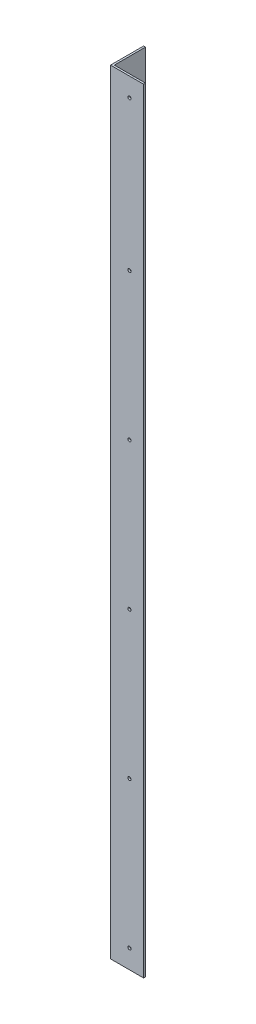
ISO-10303-21;
HEADER;
FILE_DESCRIPTION(('STEP AP214'),'2;1');
FILE_NAME('part.step','',(''),(''),'','','');
FILE_SCHEMA(('AUTOMOTIVE_DESIGN { 1 0 10303 214 1 1 1 1 }'));
ENDSEC;
DATA;
#1=APPLICATION_CONTEXT('core data for automotive mechanical design processes');
#2=APPLICATION_PROTOCOL_DEFINITION('international standard','automotive_design',2000,#1);
#3=PRODUCT_CONTEXT('',#1,'mechanical');
#4=PRODUCT('Part','Part','',(#3));
#5=PRODUCT_RELATED_PRODUCT_CATEGORY('part','',(#4));
#6=PRODUCT_DEFINITION_FORMATION('','',#4);
#7=PRODUCT_DEFINITION_CONTEXT('part definition',#1,'design');
#8=PRODUCT_DEFINITION('design','',#6,#7);
#9=PRODUCT_DEFINITION_SHAPE('','',#8);
#10=(LENGTH_UNIT() NAMED_UNIT(*) SI_UNIT(.MILLI.,.METRE.));
#11=(NAMED_UNIT(*) PLANE_ANGLE_UNIT() SI_UNIT($,.RADIAN.));
#12=(NAMED_UNIT(*) SI_UNIT($,.STERADIAN.) SOLID_ANGLE_UNIT());
#13=UNCERTAINTY_MEASURE_WITH_UNIT(LENGTH_MEASURE(1.E-05),#10,'distance_accuracy_value','');
#14=(GEOMETRIC_REPRESENTATION_CONTEXT(3) GLOBAL_UNCERTAINTY_ASSIGNED_CONTEXT((#13)) GLOBAL_UNIT_ASSIGNED_CONTEXT((#10,
#11,#12)) REPRESENTATION_CONTEXT('',''));
#15=CARTESIAN_POINT('',(0.,0.,0.));
#16=DIRECTION('',(0.,0.,1.));
#17=DIRECTION('',(1.,0.,0.));
#18=AXIS2_PLACEMENT_3D('',#15,#16,#17);
#19=CARTESIAN_POINT('',(0.,819.,-35.));
#20=DIRECTION('',(1.,0.,0.));
#21=DIRECTION('',(0.,0.,-1.));
#22=AXIS2_PLACEMENT_3D('',#19,#20,#21);
#23=PLANE('',#22);
#24=DIRECTION('',(0.,0.,1.));
#25=VECTOR('',#24,1.);
#26=CARTESIAN_POINT('',(0.,0.,-35.));
#27=LINE('',#26,#25);
#28=CARTESIAN_POINT('',(0.,0.,-35.));
#29=VERTEX_POINT('',#28);
#30=CARTESIAN_POINT('',(0.,0.,0.));
#31=VERTEX_POINT('',#30);
#32=EDGE_CURVE('E119',#29,#31,#27,.T.);
#33=ORIENTED_EDGE('',*,*,#32,.T.);
#34=DIRECTION('',(0.,-1.,0.));
#35=VECTOR('',#34,1.);
#36=CARTESIAN_POINT('',(0.,819.,0.));
#37=LINE('',#36,#35);
#38=CARTESIAN_POINT('',(0.,819.,0.));
#39=VERTEX_POINT('',#38);
#40=EDGE_CURVE('E11',#39,#31,#37,.T.);
#41=ORIENTED_EDGE('',*,*,#40,.F.);
#42=DIRECTION('',(0.,0.,1.));
#43=VECTOR('',#42,1.);
#44=CARTESIAN_POINT('',(0.,819.,-35.));
#45=LINE('',#44,#43);
#46=CARTESIAN_POINT('',(0.,819.,-35.));
#47=VERTEX_POINT('',#46);
#48=EDGE_CURVE('E130',#47,#39,#45,.T.);
#49=ORIENTED_EDGE('',*,*,#48,.F.);
#50=DIRECTION('',(0.,-1.,0.));
#51=VECTOR('',#50,1.);
#52=CARTESIAN_POINT('',(0.,819.,-35.));
#53=LINE('',#52,#51);
#54=EDGE_CURVE('E115',#47,#29,#53,.T.);
#55=ORIENTED_EDGE('',*,*,#54,.T.);
#56=EDGE_LOOP('',(#33,#41,#49,#55));
#57=FACE_BOUND('',#56,.T.);
#58=ADVANCED_FACE('F33',(#57),#23,.F.);
#59=CARTESIAN_POINT('',(0.,819.,0.));
#60=DIRECTION('',(0.,0.,-1.));
#61=DIRECTION('',(-1.,0.,0.));
#62=AXIS2_PLACEMENT_3D('',#59,#60,#61);
#63=PLANE('',#62);
#64=CARTESIAN_POINT('',(20.,799.,0.));
#65=DIRECTION('',(0.,0.,1.));
#66=DIRECTION('',(1.,0.,0.));
#67=AXIS2_PLACEMENT_3D('',#64,#65,#66);
#68=CIRCLE('',#67,1.69999999999999);
#69=CARTESIAN_POINT('',(21.7,799.,0.));
#70=VERTEX_POINT('',#69);
#71=EDGE_CURVE('E162',#70,#70,#68,.T.);
#72=ORIENTED_EDGE('',*,*,#71,.F.);
#73=EDGE_LOOP('',(#72));
#74=FACE_BOUND('',#73,.T.);
#75=CARTESIAN_POINT('',(20.,640.8,0.));
#76=DIRECTION('',(0.,0.,1.));
#77=DIRECTION('',(1.,0.,0.));
#78=AXIS2_PLACEMENT_3D('',#75,#76,#77);
#79=CIRCLE('',#78,1.69999999999999);
#80=CARTESIAN_POINT('',(21.7,640.8,0.));
#81=VERTEX_POINT('',#80);
#82=EDGE_CURVE('E152',#81,#81,#79,.T.);
#83=ORIENTED_EDGE('',*,*,#82,.F.);
#84=EDGE_LOOP('',(#83));
#85=FACE_BOUND('',#84,.T.);
#86=CARTESIAN_POINT('',(20.0000000000001,175.2,0.));
#87=DIRECTION('',(0.,0.,1.));
#88=DIRECTION('',(1.,0.,0.));
#89=AXIS2_PLACEMENT_3D('',#86,#87,#88);
#90=CIRCLE('',#89,1.7);
#91=CARTESIAN_POINT('',(21.7000000000001,175.2,0.));
#92=VERTEX_POINT('',#91);
#93=EDGE_CURVE('E149',#92,#92,#90,.T.);
#94=ORIENTED_EDGE('',*,*,#93,.F.);
#95=EDGE_LOOP('',(#94));
#96=FACE_BOUND('',#95,.T.);
#97=CARTESIAN_POINT('',(20.,485.6,0.));
#98=DIRECTION('',(0.,0.,1.));
#99=DIRECTION('',(1.,0.,0.));
#100=AXIS2_PLACEMENT_3D('',#97,#98,#99);
#101=CIRCLE('',#100,1.69999999999999);
#102=CARTESIAN_POINT('',(21.7,485.6,0.));
#103=VERTEX_POINT('',#102);
#104=EDGE_CURVE('E146',#103,#103,#101,.T.);
#105=ORIENTED_EDGE('',*,*,#104,.F.);
#106=EDGE_LOOP('',(#105));
#107=FACE_BOUND('',#106,.T.);
#108=CARTESIAN_POINT('',(20.0000000000001,330.4,0.));
#109=DIRECTION('',(0.,0.,1.));
#110=DIRECTION('',(1.,0.,0.));
#111=AXIS2_PLACEMENT_3D('',#108,#109,#110);
#112=CIRCLE('',#111,1.69999999999999);
#113=CARTESIAN_POINT('',(21.7000000000001,330.4,0.));
#114=VERTEX_POINT('',#113);
#115=EDGE_CURVE('E142',#114,#114,#112,.T.);
#116=ORIENTED_EDGE('',*,*,#115,.F.);
#117=EDGE_LOOP('',(#116));
#118=FACE_BOUND('',#117,.T.);
#119=CARTESIAN_POINT('',(20.0000000000001,20.,0.));
#120=DIRECTION('',(0.,0.,1.));
#121=DIRECTION('',(1.,0.,0.));
#122=AXIS2_PLACEMENT_3D('',#119,#120,#121);
#123=CIRCLE('',#122,1.7);
#124=CARTESIAN_POINT('',(21.7000000000001,20.,0.));
#125=VERTEX_POINT('',#124);
#126=EDGE_CURVE('E138',#125,#125,#123,.T.);
#127=ORIENTED_EDGE('',*,*,#126,.F.);
#128=EDGE_LOOP('',(#127));
#129=FACE_BOUND('',#128,.T.);
#130=DIRECTION('',(1.,0.,0.));
#131=VECTOR('',#130,1.);
#132=CARTESIAN_POINT('',(0.,0.,0.));
#133=LINE('',#132,#131);
#134=CARTESIAN_POINT('',(35.,0.,0.));
#135=VERTEX_POINT('',#134);
#136=EDGE_CURVE('E122',#31,#135,#133,.T.);
#137=ORIENTED_EDGE('',*,*,#136,.T.);
#138=DIRECTION('',(0.,-1.,0.));
#139=VECTOR('',#138,1.);
#140=CARTESIAN_POINT('',(35.,819.,0.));
#141=LINE('',#140,#139);
#142=CARTESIAN_POINT('',(35.,819.,0.));
#143=VERTEX_POINT('',#142);
#144=EDGE_CURVE('E42',#143,#135,#141,.T.);
#145=ORIENTED_EDGE('',*,*,#144,.F.);
#146=DIRECTION('',(1.,0.,0.));
#147=VECTOR('',#146,1.);
#148=CARTESIAN_POINT('',(0.,819.,0.));
#149=LINE('',#148,#147);
#150=EDGE_CURVE('E88',#39,#143,#149,.T.);
#151=ORIENTED_EDGE('',*,*,#150,.F.);
#152=ORIENTED_EDGE('',*,*,#40,.T.);
#153=EDGE_LOOP('',(#137,#145,#151,#152));
#154=FACE_BOUND('',#153,.T.);
#155=ADVANCED_FACE('F174',(#74,#85,#96,#107,#118,#129,#154),#63,.F.);
#156=CARTESIAN_POINT('',(35.,819.,0.));
#157=DIRECTION('',(-1.,0.,0.));
#158=DIRECTION('',(0.,0.,1.));
#159=AXIS2_PLACEMENT_3D('',#156,#157,#158);
#160=PLANE('',#159);
#161=DIRECTION('',(0.,0.,-1.));
#162=VECTOR('',#161,1.);
#163=CARTESIAN_POINT('',(35.,0.,0.));
#164=LINE('',#163,#162);
#165=CARTESIAN_POINT('',(35.,0.,-2.));
#166=VERTEX_POINT('',#165);
#167=EDGE_CURVE('E125',#135,#166,#164,.T.);
#168=ORIENTED_EDGE('',*,*,#167,.T.);
#169=DIRECTION('',(0.,-1.,0.));
#170=VECTOR('',#169,1.);
#171=CARTESIAN_POINT('',(35.,819.,-2.));
#172=LINE('',#171,#170);
#173=CARTESIAN_POINT('',(35.,819.,-2.));
#174=VERTEX_POINT('',#173);
#175=EDGE_CURVE('E110',#174,#166,#172,.T.);
#176=ORIENTED_EDGE('',*,*,#175,.F.);
#177=DIRECTION('',(0.,0.,-1.));
#178=VECTOR('',#177,1.);
#179=CARTESIAN_POINT('',(35.,819.,0.));
#180=LINE('',#179,#178);
#181=EDGE_CURVE('E101',#143,#174,#180,.T.);
#182=ORIENTED_EDGE('',*,*,#181,.F.);
#183=ORIENTED_EDGE('',*,*,#144,.T.);
#184=EDGE_LOOP('',(#168,#176,#182,#183));
#185=FACE_BOUND('',#184,.T.);
#186=ADVANCED_FACE('F177',(#185),#160,.F.);
#187=CARTESIAN_POINT('',(35.,819.,-2.));
#188=DIRECTION('',(0.,0.,1.));
#189=DIRECTION('',(1.,0.,0.));
#190=AXIS2_PLACEMENT_3D('',#187,#188,#189);
#191=PLANE('',#190);
#192=CARTESIAN_POINT('',(20.,799.,-2.));
#193=DIRECTION('',(0.,0.,1.));
#194=DIRECTION('',(1.,0.,0.));
#195=AXIS2_PLACEMENT_3D('',#192,#193,#194);
#196=CIRCLE('',#195,1.69999999999999);
#197=CARTESIAN_POINT('',(21.7,799.,-2.));
#198=VERTEX_POINT('',#197);
#199=EDGE_CURVE('E36',#198,#198,#196,.T.);
#200=ORIENTED_EDGE('',*,*,#199,.T.);
#201=EDGE_LOOP('',(#200));
#202=FACE_BOUND('',#201,.T.);
#203=CARTESIAN_POINT('',(20.,640.8,-2.));
#204=DIRECTION('',(0.,0.,1.));
#205=DIRECTION('',(1.,0.,0.));
#206=AXIS2_PLACEMENT_3D('',#203,#204,#205);
#207=CIRCLE('',#206,1.69999999999999);
#208=CARTESIAN_POINT('',(21.7,640.8,-2.));
#209=VERTEX_POINT('',#208);
#210=EDGE_CURVE('E150',#209,#209,#207,.T.);
#211=ORIENTED_EDGE('',*,*,#210,.T.);
#212=EDGE_LOOP('',(#211));
#213=FACE_BOUND('',#212,.T.);
#214=CARTESIAN_POINT('',(20.0000000000001,175.2,-2.));
#215=DIRECTION('',(0.,0.,1.));
#216=DIRECTION('',(1.,0.,0.));
#217=AXIS2_PLACEMENT_3D('',#214,#215,#216);
#218=CIRCLE('',#217,1.7);
#219=CARTESIAN_POINT('',(21.7000000000001,175.2,-2.));
#220=VERTEX_POINT('',#219);
#221=EDGE_CURVE('E147',#220,#220,#218,.T.);
#222=ORIENTED_EDGE('',*,*,#221,.T.);
#223=EDGE_LOOP('',(#222));
#224=FACE_BOUND('',#223,.T.);
#225=CARTESIAN_POINT('',(20.,485.6,-2.));
#226=DIRECTION('',(0.,0.,1.));
#227=DIRECTION('',(1.,0.,0.));
#228=AXIS2_PLACEMENT_3D('',#225,#226,#227);
#229=CIRCLE('',#228,1.69999999999999);
#230=CARTESIAN_POINT('',(21.7,485.6,-2.));
#231=VERTEX_POINT('',#230);
#232=EDGE_CURVE('E143',#231,#231,#229,.T.);
#233=ORIENTED_EDGE('',*,*,#232,.T.);
#234=EDGE_LOOP('',(#233));
#235=FACE_BOUND('',#234,.T.);
#236=CARTESIAN_POINT('',(20.0000000000001,330.4,-2.));
#237=DIRECTION('',(0.,0.,1.));
#238=DIRECTION('',(1.,0.,0.));
#239=AXIS2_PLACEMENT_3D('',#236,#237,#238);
#240=CIRCLE('',#239,1.69999999999999);
#241=CARTESIAN_POINT('',(21.7000000000001,330.4,-2.));
#242=VERTEX_POINT('',#241);
#243=EDGE_CURVE('E139',#242,#242,#240,.T.);
#244=ORIENTED_EDGE('',*,*,#243,.T.);
#245=EDGE_LOOP('',(#244));
#246=FACE_BOUND('',#245,.T.);
#247=CARTESIAN_POINT('',(20.0000000000001,20.,-2.));
#248=DIRECTION('',(0.,0.,1.));
#249=DIRECTION('',(1.,0.,0.));
#250=AXIS2_PLACEMENT_3D('',#247,#248,#249);
#251=CIRCLE('',#250,1.7);
#252=CARTESIAN_POINT('',(21.7000000000001,20.,-2.));
#253=VERTEX_POINT('',#252);
#254=EDGE_CURVE('E123',#253,#253,#251,.T.);
#255=ORIENTED_EDGE('',*,*,#254,.T.);
#256=EDGE_LOOP('',(#255));
#257=FACE_BOUND('',#256,.T.);
#258=DIRECTION('',(-1.,0.,0.));
#259=VECTOR('',#258,1.);
#260=CARTESIAN_POINT('',(35.,0.,-2.));
#261=LINE('',#260,#259);
#262=CARTESIAN_POINT('',(2.,0.,-2.));
#263=VERTEX_POINT('',#262);
#264=EDGE_CURVE('E109',#166,#263,#261,.T.);
#265=ORIENTED_EDGE('',*,*,#264,.T.);
#266=DIRECTION('',(0.,-1.,0.));
#267=VECTOR('',#266,1.);
#268=CARTESIAN_POINT('',(2.,819.,-2.));
#269=LINE('',#268,#267);
#270=CARTESIAN_POINT('',(2.,819.,-2.));
#271=VERTEX_POINT('',#270);
#272=EDGE_CURVE('E106',#271,#263,#269,.T.);
#273=ORIENTED_EDGE('',*,*,#272,.F.);
#274=DIRECTION('',(-1.,0.,0.));
#275=VECTOR('',#274,1.);
#276=CARTESIAN_POINT('',(35.,819.,-2.));
#277=LINE('',#276,#275);
#278=EDGE_CURVE('E95',#174,#271,#277,.T.);
#279=ORIENTED_EDGE('',*,*,#278,.F.);
#280=ORIENTED_EDGE('',*,*,#175,.T.);
#281=EDGE_LOOP('',(#265,#273,#279,#280));
#282=FACE_BOUND('',#281,.T.);
#283=ADVANCED_FACE('F107',(#202,#213,#224,#235,#246,#257,#282),#191,.F.);
#284=CARTESIAN_POINT('',(2.,819.,-2.));
#285=DIRECTION('',(-1.,0.,0.));
#286=DIRECTION('',(0.,0.,1.));
#287=AXIS2_PLACEMENT_3D('',#284,#285,#286);
#288=PLANE('',#287);
#289=DIRECTION('',(0.,0.,-1.));
#290=VECTOR('',#289,1.);
#291=CARTESIAN_POINT('',(2.,0.,-2.));
#292=LINE('',#291,#290);
#293=CARTESIAN_POINT('',(2.,0.,-35.));
#294=VERTEX_POINT('',#293);
#295=EDGE_CURVE('E74',#263,#294,#292,.T.);
#296=ORIENTED_EDGE('',*,*,#295,.T.);
#297=DIRECTION('',(0.,-1.,0.));
#298=VECTOR('',#297,1.);
#299=CARTESIAN_POINT('',(2.,819.,-35.));
#300=LINE('',#299,#298);
#301=CARTESIAN_POINT('',(2.,819.,-35.));
#302=VERTEX_POINT('',#301);
#303=EDGE_CURVE('E111',#302,#294,#300,.T.);
#304=ORIENTED_EDGE('',*,*,#303,.F.);
#305=DIRECTION('',(0.,0.,-1.));
#306=VECTOR('',#305,1.);
#307=CARTESIAN_POINT('',(2.,819.,-2.));
#308=LINE('',#307,#306);
#309=EDGE_CURVE('E99',#271,#302,#308,.T.);
#310=ORIENTED_EDGE('',*,*,#309,.F.);
#311=ORIENTED_EDGE('',*,*,#272,.T.);
#312=EDGE_LOOP('',(#296,#304,#310,#311));
#313=FACE_BOUND('',#312,.T.);
#314=ADVANCED_FACE('F113',(#313),#288,.F.);
#315=CARTESIAN_POINT('',(2.,819.,-35.));
#316=DIRECTION('',(0.,0.,1.));
#317=DIRECTION('',(1.,0.,0.));
#318=AXIS2_PLACEMENT_3D('',#315,#316,#317);
#319=PLANE('',#318);
#320=DIRECTION('',(-1.,0.,0.));
#321=VECTOR('',#320,1.);
#322=CARTESIAN_POINT('',(2.,0.,-35.));
#323=LINE('',#322,#321);
#324=EDGE_CURVE('E80',#294,#29,#323,.T.);
#325=ORIENTED_EDGE('',*,*,#324,.T.);
#326=ORIENTED_EDGE('',*,*,#54,.F.);
#327=DIRECTION('',(-1.,0.,0.));
#328=VECTOR('',#327,1.);
#329=CARTESIAN_POINT('',(2.,819.,-35.));
#330=LINE('',#329,#328);
#331=EDGE_CURVE('E51',#302,#47,#330,.T.);
#332=ORIENTED_EDGE('',*,*,#331,.F.);
#333=ORIENTED_EDGE('',*,*,#303,.T.);
#334=EDGE_LOOP('',(#325,#326,#332,#333));
#335=FACE_BOUND('',#334,.T.);
#336=ADVANCED_FACE('F182',(#335),#319,.F.);
#337=CARTESIAN_POINT('',(0.,819.,0.));
#338=DIRECTION('',(0.,1.,0.));
#339=DIRECTION('',(0.,0.,1.));
#340=AXIS2_PLACEMENT_3D('',#337,#338,#339);
#341=PLANE('',#340);
#342=ORIENTED_EDGE('',*,*,#48,.T.);
#343=ORIENTED_EDGE('',*,*,#150,.T.);
#344=ORIENTED_EDGE('',*,*,#181,.T.);
#345=ORIENTED_EDGE('',*,*,#278,.T.);
#346=ORIENTED_EDGE('',*,*,#309,.T.);
#347=ORIENTED_EDGE('',*,*,#331,.T.);
#348=EDGE_LOOP('',(#342,#343,#344,#345,#346,#347));
#349=FACE_BOUND('',#348,.T.);
#350=ADVANCED_FACE('F97',(#349),#341,.T.);
#351=CARTESIAN_POINT('',(0.,0.,0.));
#352=DIRECTION('',(0.,1.,0.));
#353=DIRECTION('',(0.,0.,1.));
#354=AXIS2_PLACEMENT_3D('',#351,#352,#353);
#355=PLANE('',#354);
#356=ORIENTED_EDGE('',*,*,#32,.F.);
#357=ORIENTED_EDGE('',*,*,#324,.F.);
#358=ORIENTED_EDGE('',*,*,#295,.F.);
#359=ORIENTED_EDGE('',*,*,#264,.F.);
#360=ORIENTED_EDGE('',*,*,#167,.F.);
#361=ORIENTED_EDGE('',*,*,#136,.F.);
#362=EDGE_LOOP('',(#356,#357,#358,#359,#360,#361));
#363=FACE_BOUND('',#362,.T.);
#364=ADVANCED_FACE('F180',(#363),#355,.F.);
#365=CARTESIAN_POINT('',(20.0000000000001,20.,-35.));
#366=DIRECTION('',(0.,0.,1.));
#367=DIRECTION('',(1.,0.,0.));
#368=AXIS2_PLACEMENT_3D('',#365,#366,#367);
#369=CYLINDRICAL_SURFACE('',#368,1.7);
#370=ORIENTED_EDGE('',*,*,#126,.T.);
#371=EDGE_LOOP('',(#370));
#372=FACE_BOUND('',#371,.T.);
#373=ORIENTED_EDGE('',*,*,#254,.F.);
#374=EDGE_LOOP('',(#373));
#375=FACE_BOUND('',#374,.T.);
#376=ADVANCED_FACE('F218',(#372,#375),#369,.F.);
#377=CARTESIAN_POINT('',(20.0000000000001,330.4,-35.));
#378=DIRECTION('',(0.,0.,1.));
#379=DIRECTION('',(1.,0.,0.));
#380=AXIS2_PLACEMENT_3D('',#377,#378,#379);
#381=CYLINDRICAL_SURFACE('',#380,1.69999999999999);
#382=ORIENTED_EDGE('',*,*,#115,.T.);
#383=EDGE_LOOP('',(#382));
#384=FACE_BOUND('',#383,.T.);
#385=ORIENTED_EDGE('',*,*,#243,.F.);
#386=EDGE_LOOP('',(#385));
#387=FACE_BOUND('',#386,.T.);
#388=ADVANCED_FACE('F220',(#384,#387),#381,.F.);
#389=CARTESIAN_POINT('',(20.,485.6,-35.));
#390=DIRECTION('',(0.,0.,1.));
#391=DIRECTION('',(1.,0.,0.));
#392=AXIS2_PLACEMENT_3D('',#389,#390,#391);
#393=CYLINDRICAL_SURFACE('',#392,1.69999999999999);
#394=ORIENTED_EDGE('',*,*,#104,.T.);
#395=EDGE_LOOP('',(#394));
#396=FACE_BOUND('',#395,.T.);
#397=ORIENTED_EDGE('',*,*,#232,.F.);
#398=EDGE_LOOP('',(#397));
#399=FACE_BOUND('',#398,.T.);
#400=ADVANCED_FACE('F227',(#396,#399),#393,.F.);
#401=CARTESIAN_POINT('',(20.0000000000001,175.2,-35.));
#402=DIRECTION('',(0.,0.,1.));
#403=DIRECTION('',(1.,0.,0.));
#404=AXIS2_PLACEMENT_3D('',#401,#402,#403);
#405=CYLINDRICAL_SURFACE('',#404,1.7);
#406=ORIENTED_EDGE('',*,*,#93,.T.);
#407=EDGE_LOOP('',(#406));
#408=FACE_BOUND('',#407,.T.);
#409=ORIENTED_EDGE('',*,*,#221,.F.);
#410=EDGE_LOOP('',(#409));
#411=FACE_BOUND('',#410,.T.);
#412=ADVANCED_FACE('F233',(#408,#411),#405,.F.);
#413=CARTESIAN_POINT('',(20.,640.8,-35.));
#414=DIRECTION('',(0.,0.,1.));
#415=DIRECTION('',(1.,0.,0.));
#416=AXIS2_PLACEMENT_3D('',#413,#414,#415);
#417=CYLINDRICAL_SURFACE('',#416,1.69999999999999);
#418=ORIENTED_EDGE('',*,*,#82,.T.);
#419=EDGE_LOOP('',(#418));
#420=FACE_BOUND('',#419,.T.);
#421=ORIENTED_EDGE('',*,*,#210,.F.);
#422=EDGE_LOOP('',(#421));
#423=FACE_BOUND('',#422,.T.);
#424=ADVANCED_FACE('F237',(#420,#423),#417,.F.);
#425=CARTESIAN_POINT('',(20.,799.,-35.));
#426=DIRECTION('',(0.,0.,1.));
#427=DIRECTION('',(1.,0.,0.));
#428=AXIS2_PLACEMENT_3D('',#425,#426,#427);
#429=CYLINDRICAL_SURFACE('',#428,1.69999999999999);
#430=ORIENTED_EDGE('',*,*,#71,.T.);
#431=EDGE_LOOP('',(#430));
#432=FACE_BOUND('',#431,.T.);
#433=ORIENTED_EDGE('',*,*,#199,.F.);
#434=EDGE_LOOP('',(#433));
#435=FACE_BOUND('',#434,.T.);
#436=ADVANCED_FACE('F241',(#432,#435),#429,.F.);
#437=CLOSED_SHELL('',(#58,#155,#186,#283,#314,#336,#350,#364,#376,#388,#400,#412,#424,#436));
#438=MANIFOLD_SOLID_BREP('B2',#437);
#439=ADVANCED_BREP_SHAPE_REPRESENTATION('',(#18,#438),#14);
#440=SHAPE_DEFINITION_REPRESENTATION(#9,#439);
ENDSEC;
END-ISO-10303-21;
